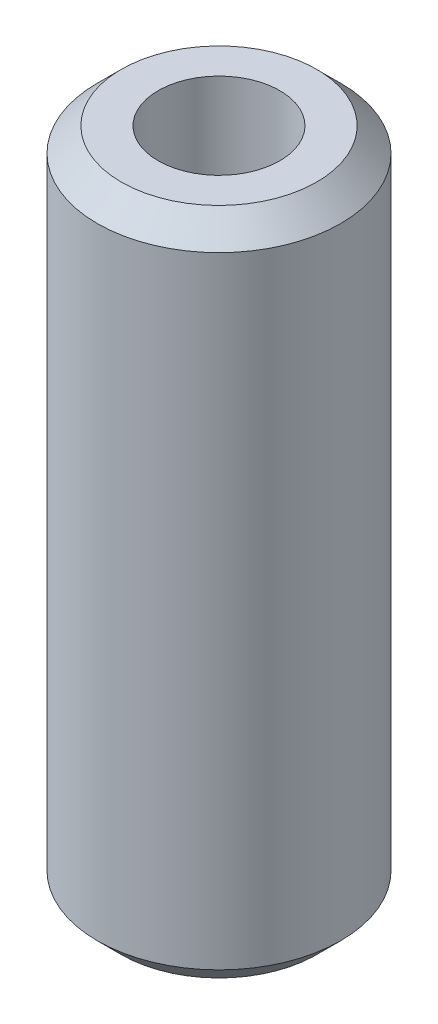
ISO-10303-21;
HEADER;
FILE_DESCRIPTION(('STEP AP214'),'2;1');
FILE_NAME('part.step','',(''),(''),'','','');
FILE_SCHEMA(('AUTOMOTIVE_DESIGN { 1 0 10303 214 1 1 1 1 }'));
ENDSEC;
DATA;
#1=APPLICATION_CONTEXT('core data for automotive mechanical design processes');
#2=APPLICATION_PROTOCOL_DEFINITION('international standard','automotive_design',2000,#1);
#3=PRODUCT_CONTEXT('',#1,'mechanical');
#4=PRODUCT('Part','Part','',(#3));
#5=PRODUCT_RELATED_PRODUCT_CATEGORY('part','',(#4));
#6=PRODUCT_DEFINITION_FORMATION('','',#4);
#7=PRODUCT_DEFINITION_CONTEXT('part definition',#1,'design');
#8=PRODUCT_DEFINITION('design','',#6,#7);
#9=PRODUCT_DEFINITION_SHAPE('','',#8);
#10=(LENGTH_UNIT() NAMED_UNIT(*) SI_UNIT(.MILLI.,.METRE.));
#11=(NAMED_UNIT(*) PLANE_ANGLE_UNIT() SI_UNIT($,.RADIAN.));
#12=(NAMED_UNIT(*) SI_UNIT($,.STERADIAN.) SOLID_ANGLE_UNIT());
#13=UNCERTAINTY_MEASURE_WITH_UNIT(LENGTH_MEASURE(1.E-05),#10,'distance_accuracy_value','');
#14=(GEOMETRIC_REPRESENTATION_CONTEXT(3) GLOBAL_UNCERTAINTY_ASSIGNED_CONTEXT((#13)) GLOBAL_UNIT_ASSIGNED_CONTEXT((#10,
#11,#12)) REPRESENTATION_CONTEXT('',''));
#15=CARTESIAN_POINT('',(0.,0.,0.));
#16=DIRECTION('',(0.,0.,1.));
#17=DIRECTION('',(1.,0.,0.));
#18=AXIS2_PLACEMENT_3D('',#15,#16,#17);
#19=CARTESIAN_POINT('',(0.,34.925,0.));
#20=DIRECTION('',(0.,1.,0.));
#21=DIRECTION('',(0.,0.,1.));
#22=AXIS2_PLACEMENT_3D('',#19,#20,#21);
#23=PLANE('',#22);
#24=CARTESIAN_POINT('',(0.,34.925,0.));
#25=DIRECTION('',(0.,1.,0.));
#26=DIRECTION('',(0.,0.,1.));
#27=AXIS2_PLACEMENT_3D('',#24,#25,#26);
#28=CIRCLE('',#27,10.2);
#29=CARTESIAN_POINT('',(0.,34.925,10.2));
#30=VERTEX_POINT('',#29);
#31=EDGE_CURVE('E10',#30,#30,#28,.T.);
#32=ORIENTED_EDGE('',*,*,#31,.T.);
#33=EDGE_LOOP('',(#32));
#34=FACE_BOUND('',#33,.T.);
#35=CARTESIAN_POINT('',(0.,34.925,0.));
#36=DIRECTION('',(0.,1.,0.));
#37=DIRECTION('',(0.,0.,1.));
#38=AXIS2_PLACEMENT_3D('',#35,#36,#37);
#39=CIRCLE('',#38,6.35);
#40=CARTESIAN_POINT('',(0.,34.925,6.35));
#41=VERTEX_POINT('',#40);
#42=EDGE_CURVE('E55',#41,#41,#39,.T.);
#43=ORIENTED_EDGE('',*,*,#42,.F.);
#44=EDGE_LOOP('',(#43));
#45=FACE_BOUND('',#44,.T.);
#46=ADVANCED_FACE('F34',(#34,#45),#23,.T.);
#47=CARTESIAN_POINT('',(0.,-34.925,0.));
#48=DIRECTION('',(0.,1.,0.));
#49=DIRECTION('',(0.,0.,1.));
#50=AXIS2_PLACEMENT_3D('',#47,#48,#49);
#51=PLANE('',#50);
#52=CARTESIAN_POINT('',(0.,-34.925,0.));
#53=DIRECTION('',(0.,1.,0.));
#54=DIRECTION('',(0.,0.,1.));
#55=AXIS2_PLACEMENT_3D('',#52,#53,#54);
#56=CIRCLE('',#55,10.2);
#57=CARTESIAN_POINT('',(0.,-34.925,10.2));
#58=VERTEX_POINT('',#57);
#59=EDGE_CURVE('E42',#58,#58,#56,.F.);
#60=ORIENTED_EDGE('',*,*,#59,.T.);
#61=EDGE_LOOP('',(#60));
#62=FACE_BOUND('',#61,.T.);
#63=CARTESIAN_POINT('',(0.,-34.925,0.));
#64=DIRECTION('',(0.,1.,0.));
#65=DIRECTION('',(0.,0.,1.));
#66=AXIS2_PLACEMENT_3D('',#63,#64,#65);
#67=CIRCLE('',#66,6.35);
#68=CARTESIAN_POINT('',(0.,-34.925,6.35));
#69=VERTEX_POINT('',#68);
#70=EDGE_CURVE('E56',#69,#69,#67,.T.);
#71=ORIENTED_EDGE('',*,*,#70,.T.);
#72=EDGE_LOOP('',(#71));
#73=FACE_BOUND('',#72,.T.);
#74=ADVANCED_FACE('F66',(#62,#73),#51,.F.);
#75=CARTESIAN_POINT('',(0.,34.925,0.));
#76=DIRECTION('',(0.,-1.,0.));
#77=DIRECTION('',(0.,0.,-1.));
#78=AXIS2_PLACEMENT_3D('',#75,#76,#77);
#79=CYLINDRICAL_SURFACE('',#78,12.7);
#80=CARTESIAN_POINT('',(0.,-32.425,0.));
#81=DIRECTION('',(0.,1.,0.));
#82=DIRECTION('',(0.,0.,1.));
#83=AXIS2_PLACEMENT_3D('',#80,#81,#82);
#84=CIRCLE('',#83,12.7);
#85=CARTESIAN_POINT('',(0.,-32.425,12.7));
#86=VERTEX_POINT('',#85);
#87=EDGE_CURVE('E46',#86,#86,#84,.T.);
#88=ORIENTED_EDGE('',*,*,#87,.T.);
#89=EDGE_LOOP('',(#88));
#90=FACE_BOUND('',#89,.T.);
#91=CARTESIAN_POINT('',(0.,32.425,0.));
#92=DIRECTION('',(0.,1.,0.));
#93=DIRECTION('',(0.,0.,1.));
#94=AXIS2_PLACEMENT_3D('',#91,#92,#93);
#95=CIRCLE('',#94,12.7);
#96=CARTESIAN_POINT('',(0.,32.425,12.7));
#97=VERTEX_POINT('',#96);
#98=EDGE_CURVE('E50',#97,#97,#95,.F.);
#99=ORIENTED_EDGE('',*,*,#98,.T.);
#100=EDGE_LOOP('',(#99));
#101=FACE_BOUND('',#100,.T.);
#102=ADVANCED_FACE('F71',(#90,#101),#79,.T.);
#103=CARTESIAN_POINT('',(0.,34.925,0.));
#104=DIRECTION('',(0.,-1.,0.));
#105=DIRECTION('',(0.,0.,-1.));
#106=AXIS2_PLACEMENT_3D('',#103,#104,#105);
#107=CYLINDRICAL_SURFACE('',#106,6.35);
#108=ORIENTED_EDGE('',*,*,#42,.T.);
#109=EDGE_LOOP('',(#108));
#110=FACE_BOUND('',#109,.T.);
#111=ORIENTED_EDGE('',*,*,#70,.F.);
#112=EDGE_LOOP('',(#111));
#113=FACE_BOUND('',#112,.T.);
#114=ADVANCED_FACE('F62',(#110,#113),#107,.F.);
#115=CARTESIAN_POINT('',(0.,-32.425,0.));
#116=DIRECTION('',(0.,1.,0.));
#117=DIRECTION('',(0.,0.,1.));
#118=AXIS2_PLACEMENT_3D('',#115,#116,#117);
#119=CONICAL_SURFACE('',#118,12.7,0.785398163397449);
#120=ORIENTED_EDGE('',*,*,#59,.F.);
#121=EDGE_LOOP('',(#120));
#122=FACE_BOUND('',#121,.T.);
#123=ORIENTED_EDGE('',*,*,#87,.F.);
#124=EDGE_LOOP('',(#123));
#125=FACE_BOUND('',#124,.T.);
#126=ADVANCED_FACE('F78',(#122,#125),#119,.T.);
#127=CARTESIAN_POINT('',(0.,34.925,0.));
#128=DIRECTION('',(0.,-1.,0.));
#129=DIRECTION('',(0.,0.,-1.));
#130=AXIS2_PLACEMENT_3D('',#127,#128,#129);
#131=CONICAL_SURFACE('',#130,10.2,0.785398163397446);
#132=ORIENTED_EDGE('',*,*,#98,.F.);
#133=EDGE_LOOP('',(#132));
#134=FACE_BOUND('',#133,.T.);
#135=ORIENTED_EDGE('',*,*,#31,.F.);
#136=EDGE_LOOP('',(#135));
#137=FACE_BOUND('',#136,.T.);
#138=ADVANCED_FACE('F37',(#134,#137),#131,.T.);
#139=CLOSED_SHELL('',(#46,#74,#102,#114,#126,#138));
#140=MANIFOLD_SOLID_BREP('B2',#139);
#141=ADVANCED_BREP_SHAPE_REPRESENTATION('',(#18,#140),#14);
#142=SHAPE_DEFINITION_REPRESENTATION(#9,#141);
ENDSEC;
END-ISO-10303-21;
